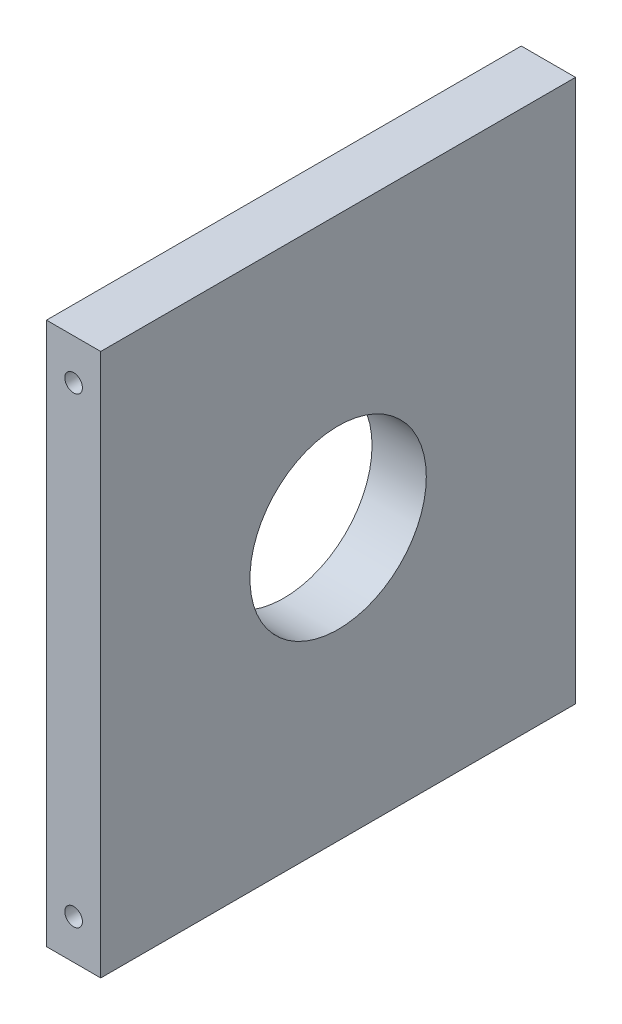
ISO-10303-21;
HEADER;
FILE_DESCRIPTION(('STEP AP214'),'2;1');
FILE_NAME('part.step','',(''),(''),'','','');
FILE_SCHEMA(('AUTOMOTIVE_DESIGN { 1 0 10303 214 1 1 1 1 }'));
ENDSEC;
DATA;
#1=APPLICATION_CONTEXT('core data for automotive mechanical design processes');
#2=APPLICATION_PROTOCOL_DEFINITION('international standard','automotive_design',2000,#1);
#3=PRODUCT_CONTEXT('',#1,'mechanical');
#4=PRODUCT('Part','Part','',(#3));
#5=PRODUCT_RELATED_PRODUCT_CATEGORY('part','',(#4));
#6=PRODUCT_DEFINITION_FORMATION('','',#4);
#7=PRODUCT_DEFINITION_CONTEXT('part definition',#1,'design');
#8=PRODUCT_DEFINITION('design','',#6,#7);
#9=PRODUCT_DEFINITION_SHAPE('','',#8);
#10=(LENGTH_UNIT() NAMED_UNIT(*) SI_UNIT(.MILLI.,.METRE.));
#11=(NAMED_UNIT(*) PLANE_ANGLE_UNIT() SI_UNIT($,.RADIAN.));
#12=(NAMED_UNIT(*) SI_UNIT($,.STERADIAN.) SOLID_ANGLE_UNIT());
#13=UNCERTAINTY_MEASURE_WITH_UNIT(LENGTH_MEASURE(1.E-05),#10,'distance_accuracy_value','');
#14=(GEOMETRIC_REPRESENTATION_CONTEXT(3) GLOBAL_UNCERTAINTY_ASSIGNED_CONTEXT((#13)) GLOBAL_UNIT_ASSIGNED_CONTEXT((#10,
#11,#12)) REPRESENTATION_CONTEXT('',''));
#15=CARTESIAN_POINT('',(0.,0.,0.));
#16=DIRECTION('',(0.,0.,1.));
#17=DIRECTION('',(1.,0.,0.));
#18=AXIS2_PLACEMENT_3D('',#15,#16,#17);
#19=CARTESIAN_POINT('',(8.,40.,-35.));
#20=DIRECTION('',(0.,0.,1.));
#21=DIRECTION('',(0.,-1.,0.));
#22=AXIS2_PLACEMENT_3D('',#19,#20,#21);
#23=PLANE('',#22);
#24=CARTESIAN_POINT('',(3.99999999999995,34.,-35.));
#25=DIRECTION('',(0.,0.,1.));
#26=DIRECTION('',(1.,0.,0.));
#27=AXIS2_PLACEMENT_3D('',#24,#25,#26);
#28=CIRCLE('',#27,1.3);
#29=CARTESIAN_POINT('',(5.29999999999995,34.,-35.));
#30=VERTEX_POINT('',#29);
#31=EDGE_CURVE('E136',#30,#30,#28,.T.);
#32=ORIENTED_EDGE('',*,*,#31,.T.);
#33=EDGE_LOOP('',(#32));
#34=FACE_BOUND('',#33,.T.);
#35=CARTESIAN_POINT('',(3.99999999999995,-34.1567564082777,-35.));
#36=DIRECTION('',(0.,0.,1.));
#37=DIRECTION('',(1.,0.,0.));
#38=AXIS2_PLACEMENT_3D('',#35,#36,#37);
#39=CIRCLE('',#38,1.3);
#40=CARTESIAN_POINT('',(5.29999999999995,-34.1567564082777,-35.));
#41=VERTEX_POINT('',#40);
#42=EDGE_CURVE('E130',#41,#41,#39,.T.);
#43=ORIENTED_EDGE('',*,*,#42,.T.);
#44=EDGE_LOOP('',(#43));
#45=FACE_BOUND('',#44,.T.);
#46=DIRECTION('',(0.,1.,0.));
#47=VECTOR('',#46,1.);
#48=CARTESIAN_POINT('',(0.,40.,-35.));
#49=LINE('',#48,#47);
#50=CARTESIAN_POINT('',(0.,-40.,-35.));
#51=VERTEX_POINT('',#50);
#52=CARTESIAN_POINT('',(0.,40.,-35.));
#53=VERTEX_POINT('',#52);
#54=EDGE_CURVE('E98',#51,#53,#49,.T.);
#55=ORIENTED_EDGE('',*,*,#54,.T.);
#56=DIRECTION('',(-1.,0.,0.));
#57=VECTOR('',#56,1.);
#58=CARTESIAN_POINT('',(8.,40.,-35.));
#59=LINE('',#58,#57);
#60=CARTESIAN_POINT('',(8.,40.,-35.));
#61=VERTEX_POINT('',#60);
#62=EDGE_CURVE('E11',#61,#53,#59,.T.);
#63=ORIENTED_EDGE('',*,*,#62,.F.);
#64=DIRECTION('',(0.,1.,0.));
#65=VECTOR('',#64,1.);
#66=CARTESIAN_POINT('',(8.,40.,-35.));
#67=LINE('',#66,#65);
#68=CARTESIAN_POINT('',(8.,-40.,-35.));
#69=VERTEX_POINT('',#68);
#70=EDGE_CURVE('E86',#69,#61,#67,.T.);
#71=ORIENTED_EDGE('',*,*,#70,.F.);
#72=DIRECTION('',(-1.,0.,0.));
#73=VECTOR('',#72,1.);
#74=CARTESIAN_POINT('',(8.,-40.,-35.));
#75=LINE('',#74,#73);
#76=EDGE_CURVE('E94',#69,#51,#75,.T.);
#77=ORIENTED_EDGE('',*,*,#76,.T.);
#78=EDGE_LOOP('',(#55,#63,#71,#77));
#79=FACE_BOUND('',#78,.T.);
#80=ADVANCED_FACE('F35',(#34,#45,#79),#23,.F.);
#81=CARTESIAN_POINT('',(8.,40.,35.));
#82=DIRECTION('',(0.,-1.,0.));
#83=DIRECTION('',(0.,0.,-1.));
#84=AXIS2_PLACEMENT_3D('',#81,#82,#83);
#85=PLANE('',#84);
#86=DIRECTION('',(0.,0.,1.));
#87=VECTOR('',#86,1.);
#88=CARTESIAN_POINT('',(0.,40.,35.));
#89=LINE('',#88,#87);
#90=CARTESIAN_POINT('',(0.,40.,35.));
#91=VERTEX_POINT('',#90);
#92=EDGE_CURVE('E90',#53,#91,#89,.T.);
#93=ORIENTED_EDGE('',*,*,#92,.T.);
#94=DIRECTION('',(-1.,0.,0.));
#95=VECTOR('',#94,1.);
#96=CARTESIAN_POINT('',(8.,40.,35.));
#97=LINE('',#96,#95);
#98=CARTESIAN_POINT('',(8.,40.,35.));
#99=VERTEX_POINT('',#98);
#100=EDGE_CURVE('E43',#99,#91,#97,.T.);
#101=ORIENTED_EDGE('',*,*,#100,.F.);
#102=DIRECTION('',(0.,0.,1.));
#103=VECTOR('',#102,1.);
#104=CARTESIAN_POINT('',(8.,40.,35.));
#105=LINE('',#104,#103);
#106=EDGE_CURVE('E81',#61,#99,#105,.T.);
#107=ORIENTED_EDGE('',*,*,#106,.F.);
#108=ORIENTED_EDGE('',*,*,#62,.T.);
#109=EDGE_LOOP('',(#93,#101,#107,#108));
#110=FACE_BOUND('',#109,.T.);
#111=ADVANCED_FACE('F89',(#110),#85,.F.);
#112=CARTESIAN_POINT('',(8.,40.,35.));
#113=DIRECTION('',(0.,0.,-1.));
#114=DIRECTION('',(0.,1.,0.));
#115=AXIS2_PLACEMENT_3D('',#112,#113,#114);
#116=PLANE('',#115);
#117=CARTESIAN_POINT('',(3.99999999999995,34.,35.));
#118=DIRECTION('',(0.,0.,1.));
#119=DIRECTION('',(1.,0.,0.));
#120=AXIS2_PLACEMENT_3D('',#117,#118,#119);
#121=CIRCLE('',#120,1.3);
#122=CARTESIAN_POINT('',(5.29999999999995,34.,35.));
#123=VERTEX_POINT('',#122);
#124=EDGE_CURVE('E125',#123,#123,#121,.T.);
#125=ORIENTED_EDGE('',*,*,#124,.F.);
#126=EDGE_LOOP('',(#125));
#127=FACE_BOUND('',#126,.T.);
#128=CARTESIAN_POINT('',(3.99999999999995,-34.1567564082777,35.));
#129=DIRECTION('',(0.,0.,1.));
#130=DIRECTION('',(1.,0.,0.));
#131=AXIS2_PLACEMENT_3D('',#128,#129,#130);
#132=CIRCLE('',#131,1.3);
#133=CARTESIAN_POINT('',(5.29999999999995,-34.1567564082777,35.));
#134=VERTEX_POINT('',#133);
#135=EDGE_CURVE('E118',#134,#134,#132,.T.);
#136=ORIENTED_EDGE('',*,*,#135,.F.);
#137=EDGE_LOOP('',(#136));
#138=FACE_BOUND('',#137,.T.);
#139=DIRECTION('',(0.,-1.,0.));
#140=VECTOR('',#139,1.);
#141=CARTESIAN_POINT('',(0.,40.,35.));
#142=LINE('',#141,#140);
#143=CARTESIAN_POINT('',(0.,-40.,35.));
#144=VERTEX_POINT('',#143);
#145=EDGE_CURVE('E68',#91,#144,#142,.T.);
#146=ORIENTED_EDGE('',*,*,#145,.T.);
#147=DIRECTION('',(-1.,0.,0.));
#148=VECTOR('',#147,1.);
#149=CARTESIAN_POINT('',(8.,-40.,35.));
#150=LINE('',#149,#148);
#151=CARTESIAN_POINT('',(8.,-40.,35.));
#152=VERTEX_POINT('',#151);
#153=EDGE_CURVE('E91',#152,#144,#150,.T.);
#154=ORIENTED_EDGE('',*,*,#153,.F.);
#155=DIRECTION('',(0.,-1.,0.));
#156=VECTOR('',#155,1.);
#157=CARTESIAN_POINT('',(8.,40.,35.));
#158=LINE('',#157,#156);
#159=EDGE_CURVE('E84',#99,#152,#158,.T.);
#160=ORIENTED_EDGE('',*,*,#159,.F.);
#161=ORIENTED_EDGE('',*,*,#100,.T.);
#162=EDGE_LOOP('',(#146,#154,#160,#161));
#163=FACE_BOUND('',#162,.T.);
#164=ADVANCED_FACE('F92',(#127,#138,#163),#116,.F.);
#165=CARTESIAN_POINT('',(8.,-40.,35.));
#166=DIRECTION('',(0.,1.,0.));
#167=DIRECTION('',(0.,0.,1.));
#168=AXIS2_PLACEMENT_3D('',#165,#166,#167);
#169=PLANE('',#168);
#170=DIRECTION('',(0.,0.,-1.));
#171=VECTOR('',#170,1.);
#172=CARTESIAN_POINT('',(0.,-40.,35.));
#173=LINE('',#172,#171);
#174=EDGE_CURVE('E74',#144,#51,#173,.T.);
#175=ORIENTED_EDGE('',*,*,#174,.T.);
#176=ORIENTED_EDGE('',*,*,#76,.F.);
#177=DIRECTION('',(0.,0.,-1.));
#178=VECTOR('',#177,1.);
#179=CARTESIAN_POINT('',(8.,-40.,35.));
#180=LINE('',#179,#178);
#181=EDGE_CURVE('E51',#152,#69,#180,.T.);
#182=ORIENTED_EDGE('',*,*,#181,.F.);
#183=ORIENTED_EDGE('',*,*,#153,.T.);
#184=EDGE_LOOP('',(#175,#176,#182,#183));
#185=FACE_BOUND('',#184,.T.);
#186=ADVANCED_FACE('F106',(#185),#169,.F.);
#187=CARTESIAN_POINT('',(8.,0.,0.));
#188=DIRECTION('',(1.,0.,0.));
#189=DIRECTION('',(0.,0.,-1.));
#190=AXIS2_PLACEMENT_3D('',#187,#188,#189);
#191=PLANE('',#190);
#192=CARTESIAN_POINT('',(8.,0.,0.));
#193=DIRECTION('',(1.,0.,0.));
#194=DIRECTION('',(0.,0.,-1.));
#195=AXIS2_PLACEMENT_3D('',#192,#193,#194);
#196=CIRCLE('',#195,13.);
#197=CARTESIAN_POINT('',(8.,0.,-13.));
#198=VERTEX_POINT('',#197);
#199=EDGE_CURVE('E112',#198,#198,#196,.T.);
#200=ORIENTED_EDGE('',*,*,#199,.F.);
#201=EDGE_LOOP('',(#200));
#202=FACE_BOUND('',#201,.T.);
#203=ORIENTED_EDGE('',*,*,#70,.T.);
#204=ORIENTED_EDGE('',*,*,#106,.T.);
#205=ORIENTED_EDGE('',*,*,#159,.T.);
#206=ORIENTED_EDGE('',*,*,#181,.T.);
#207=EDGE_LOOP('',(#203,#204,#205,#206));
#208=FACE_BOUND('',#207,.T.);
#209=ADVANCED_FACE('F82',(#202,#208),#191,.T.);
#210=CARTESIAN_POINT('',(0.,0.,0.));
#211=DIRECTION('',(1.,0.,0.));
#212=DIRECTION('',(0.,0.,-1.));
#213=AXIS2_PLACEMENT_3D('',#210,#211,#212);
#214=PLANE('',#213);
#215=CARTESIAN_POINT('',(0.,0.,0.));
#216=DIRECTION('',(1.,0.,0.));
#217=DIRECTION('',(0.,0.,-1.));
#218=AXIS2_PLACEMENT_3D('',#215,#216,#217);
#219=CIRCLE('',#218,13.);
#220=CARTESIAN_POINT('',(0.,0.,-13.));
#221=VERTEX_POINT('',#220);
#222=EDGE_CURVE('E101',#221,#221,#219,.T.);
#223=ORIENTED_EDGE('',*,*,#222,.T.);
#224=EDGE_LOOP('',(#223));
#225=FACE_BOUND('',#224,.T.);
#226=ORIENTED_EDGE('',*,*,#54,.F.);
#227=ORIENTED_EDGE('',*,*,#174,.F.);
#228=ORIENTED_EDGE('',*,*,#145,.F.);
#229=ORIENTED_EDGE('',*,*,#92,.F.);
#230=EDGE_LOOP('',(#226,#227,#228,#229));
#231=FACE_BOUND('',#230,.T.);
#232=ADVANCED_FACE('F109',(#225,#231),#214,.F.);
#233=CARTESIAN_POINT('',(0.,0.,0.));
#234=DIRECTION('',(1.,0.,0.));
#235=DIRECTION('',(0.,0.,-1.));
#236=AXIS2_PLACEMENT_3D('',#233,#234,#235);
#237=CYLINDRICAL_SURFACE('',#236,13.);
#238=ORIENTED_EDGE('',*,*,#222,.F.);
#239=EDGE_LOOP('',(#238));
#240=FACE_BOUND('',#239,.T.);
#241=ORIENTED_EDGE('',*,*,#199,.T.);
#242=EDGE_LOOP('',(#241));
#243=FACE_BOUND('',#242,.T.);
#244=ADVANCED_FACE('F187',(#240,#243),#237,.F.);
#245=CARTESIAN_POINT('',(3.99999999999995,-34.1567564082777,25.));
#246=DIRECTION('',(0.,0.,1.));
#247=DIRECTION('',(1.,0.,0.));
#248=AXIS2_PLACEMENT_3D('',#245,#246,#247);
#249=CYLINDRICAL_SURFACE('',#248,1.3);
#250=CARTESIAN_POINT('',(3.99999999999995,-34.1567564082777,25.));
#251=DIRECTION('',(0.,0.,1.));
#252=DIRECTION('',(1.,0.,0.));
#253=AXIS2_PLACEMENT_3D('',#250,#251,#252);
#254=CIRCLE('',#253,1.3);
#255=CARTESIAN_POINT('',(5.29999999999995,-34.1567564082777,25.));
#256=VERTEX_POINT('',#255);
#257=EDGE_CURVE('E121',#256,#256,#254,.T.);
#258=ORIENTED_EDGE('',*,*,#257,.F.);
#259=EDGE_LOOP('',(#258));
#260=FACE_BOUND('',#259,.T.);
#261=ORIENTED_EDGE('',*,*,#135,.T.);
#262=EDGE_LOOP('',(#261));
#263=FACE_BOUND('',#262,.T.);
#264=ADVANCED_FACE('F183',(#260,#263),#249,.F.);
#265=CARTESIAN_POINT('',(3.99999999999995,-34.1567564082777,25.));
#266=DIRECTION('',(0.,0.,1.));
#267=DIRECTION('',(1.,0.,0.));
#268=AXIS2_PLACEMENT_3D('',#265,#266,#267);
#269=PLANE('',#268);
#270=ORIENTED_EDGE('',*,*,#257,.T.);
#271=EDGE_LOOP('',(#270));
#272=FACE_BOUND('',#271,.T.);
#273=ADVANCED_FACE('F179',(#272),#269,.T.);
#274=CARTESIAN_POINT('',(3.99999999999995,34.,25.));
#275=DIRECTION('',(0.,0.,1.));
#276=DIRECTION('',(1.,0.,0.));
#277=AXIS2_PLACEMENT_3D('',#274,#275,#276);
#278=CYLINDRICAL_SURFACE('',#277,1.3);
#279=CARTESIAN_POINT('',(3.99999999999995,34.,25.));
#280=DIRECTION('',(0.,0.,1.));
#281=DIRECTION('',(1.,0.,0.));
#282=AXIS2_PLACEMENT_3D('',#279,#280,#281);
#283=CIRCLE('',#282,1.3);
#284=CARTESIAN_POINT('',(5.29999999999995,34.,25.));
#285=VERTEX_POINT('',#284);
#286=EDGE_CURVE('E115',#285,#285,#283,.T.);
#287=ORIENTED_EDGE('',*,*,#286,.F.);
#288=EDGE_LOOP('',(#287));
#289=FACE_BOUND('',#288,.T.);
#290=ORIENTED_EDGE('',*,*,#124,.T.);
#291=EDGE_LOOP('',(#290));
#292=FACE_BOUND('',#291,.T.);
#293=ADVANCED_FACE('F173',(#289,#292),#278,.F.);
#294=CARTESIAN_POINT('',(3.99999999999995,34.,25.));
#295=DIRECTION('',(0.,0.,1.));
#296=DIRECTION('',(1.,0.,0.));
#297=AXIS2_PLACEMENT_3D('',#294,#295,#296);
#298=PLANE('',#297);
#299=ORIENTED_EDGE('',*,*,#286,.T.);
#300=EDGE_LOOP('',(#299));
#301=FACE_BOUND('',#300,.T.);
#302=ADVANCED_FACE('F164',(#301),#298,.T.);
#303=CARTESIAN_POINT('',(3.99999999999995,-34.1567564082777,-25.));
#304=DIRECTION('',(0.,0.,-1.));
#305=DIRECTION('',(-1.,0.,0.));
#306=AXIS2_PLACEMENT_3D('',#303,#304,#305);
#307=CYLINDRICAL_SURFACE('',#306,1.3);
#308=CARTESIAN_POINT('',(3.99999999999995,-34.1567564082777,-25.));
#309=DIRECTION('',(0.,0.,1.));
#310=DIRECTION('',(1.,0.,0.));
#311=AXIS2_PLACEMENT_3D('',#308,#309,#310);
#312=CIRCLE('',#311,1.3);
#313=CARTESIAN_POINT('',(5.29999999999995,-34.1567564082777,-25.));
#314=VERTEX_POINT('',#313);
#315=EDGE_CURVE('E133',#314,#314,#312,.T.);
#316=ORIENTED_EDGE('',*,*,#315,.T.);
#317=EDGE_LOOP('',(#316));
#318=FACE_BOUND('',#317,.T.);
#319=ORIENTED_EDGE('',*,*,#42,.F.);
#320=EDGE_LOOP('',(#319));
#321=FACE_BOUND('',#320,.T.);
#322=ADVANCED_FACE('F162',(#318,#321),#307,.F.);
#323=CARTESIAN_POINT('',(3.99999999999995,-34.1567564082777,-25.));
#324=DIRECTION('',(0.,0.,-1.));
#325=DIRECTION('',(1.,0.,0.));
#326=AXIS2_PLACEMENT_3D('',#323,#324,#325);
#327=PLANE('',#326);
#328=ORIENTED_EDGE('',*,*,#315,.F.);
#329=EDGE_LOOP('',(#328));
#330=FACE_BOUND('',#329,.T.);
#331=ADVANCED_FACE('F151',(#330),#327,.T.);
#332=CARTESIAN_POINT('',(3.99999999999995,34.,-25.));
#333=DIRECTION('',(0.,0.,-1.));
#334=DIRECTION('',(-1.,0.,0.));
#335=AXIS2_PLACEMENT_3D('',#332,#333,#334);
#336=CYLINDRICAL_SURFACE('',#335,1.3);
#337=CARTESIAN_POINT('',(3.99999999999995,34.,-25.));
#338=DIRECTION('',(0.,0.,1.));
#339=DIRECTION('',(1.,0.,0.));
#340=AXIS2_PLACEMENT_3D('',#337,#338,#339);
#341=CIRCLE('',#340,1.3);
#342=CARTESIAN_POINT('',(5.29999999999995,34.,-25.));
#343=VERTEX_POINT('',#342);
#344=EDGE_CURVE('E122',#343,#343,#341,.T.);
#345=ORIENTED_EDGE('',*,*,#344,.T.);
#346=EDGE_LOOP('',(#345));
#347=FACE_BOUND('',#346,.T.);
#348=ORIENTED_EDGE('',*,*,#31,.F.);
#349=EDGE_LOOP('',(#348));
#350=FACE_BOUND('',#349,.T.);
#351=ADVANCED_FACE('F142',(#347,#350),#336,.F.);
#352=CARTESIAN_POINT('',(3.99999999999995,34.,-25.));
#353=DIRECTION('',(0.,0.,-1.));
#354=DIRECTION('',(1.,0.,0.));
#355=AXIS2_PLACEMENT_3D('',#352,#353,#354);
#356=PLANE('',#355);
#357=ORIENTED_EDGE('',*,*,#344,.F.);
#358=EDGE_LOOP('',(#357));
#359=FACE_BOUND('',#358,.T.);
#360=ADVANCED_FACE('F145',(#359),#356,.T.);
#361=CLOSED_SHELL('',(#80,#111,#164,#186,#209,#232,#244,#264,#273,#293,#302,#322,#331,#351,#360));
#362=MANIFOLD_SOLID_BREP('B2',#361);
#363=ADVANCED_BREP_SHAPE_REPRESENTATION('',(#18,#362),#14);
#364=SHAPE_DEFINITION_REPRESENTATION(#9,#363);
ENDSEC;
END-ISO-10303-21;
